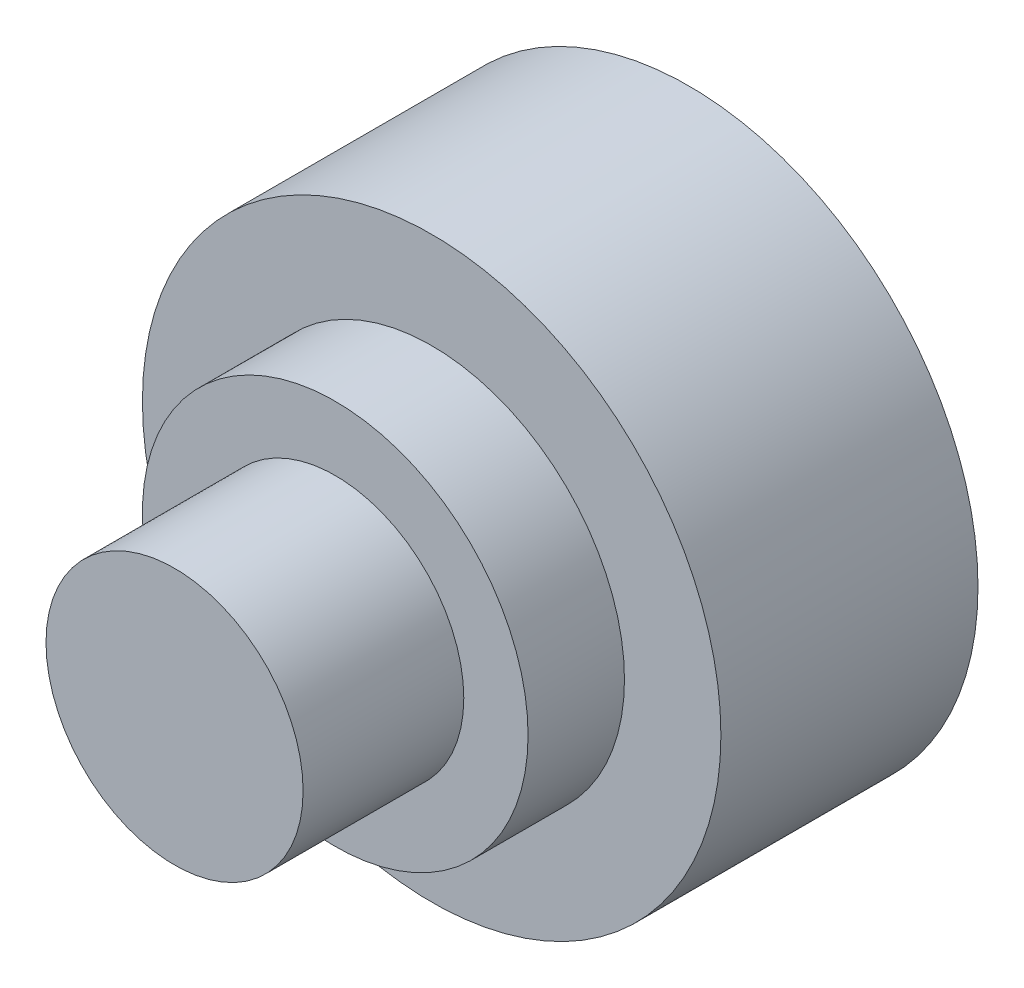
ISO-10303-21;
HEADER;
FILE_DESCRIPTION(('STEP AP214'),'2;1');
FILE_NAME('part.step','',(''),(''),'','','');
FILE_SCHEMA(('AUTOMOTIVE_DESIGN { 1 0 10303 214 1 1 1 1 }'));
ENDSEC;
DATA;
#1=APPLICATION_CONTEXT('core data for automotive mechanical design processes');
#2=APPLICATION_PROTOCOL_DEFINITION('international standard','automotive_design',2000,#1);
#3=PRODUCT_CONTEXT('',#1,'mechanical');
#4=PRODUCT('Part','Part','',(#3));
#5=PRODUCT_RELATED_PRODUCT_CATEGORY('part','',(#4));
#6=PRODUCT_DEFINITION_FORMATION('','',#4);
#7=PRODUCT_DEFINITION_CONTEXT('part definition',#1,'design');
#8=PRODUCT_DEFINITION('design','',#6,#7);
#9=PRODUCT_DEFINITION_SHAPE('','',#8);
#10=(LENGTH_UNIT() NAMED_UNIT(*) SI_UNIT(.MILLI.,.METRE.));
#11=(NAMED_UNIT(*) PLANE_ANGLE_UNIT() SI_UNIT($,.RADIAN.));
#12=(NAMED_UNIT(*) SI_UNIT($,.STERADIAN.) SOLID_ANGLE_UNIT());
#13=UNCERTAINTY_MEASURE_WITH_UNIT(LENGTH_MEASURE(1.E-05),#10,'distance_accuracy_value','');
#14=(GEOMETRIC_REPRESENTATION_CONTEXT(3) GLOBAL_UNCERTAINTY_ASSIGNED_CONTEXT((#13)) GLOBAL_UNIT_ASSIGNED_CONTEXT((#10,
#11,#12)) REPRESENTATION_CONTEXT('',''));
#15=CARTESIAN_POINT('',(0.,0.,0.));
#16=DIRECTION('',(0.,0.,1.));
#17=DIRECTION('',(1.,0.,0.));
#18=AXIS2_PLACEMENT_3D('',#15,#16,#17);
#19=CARTESIAN_POINT('',(0.,0.,8.));
#20=DIRECTION('',(0.,0.,-1.));
#21=DIRECTION('',(-1.,0.,0.));
#22=AXIS2_PLACEMENT_3D('',#19,#20,#21);
#23=CYLINDRICAL_SURFACE('',#22,9.);
#24=CARTESIAN_POINT('',(0.,0.,8.));
#25=DIRECTION('',(0.,0.,1.));
#26=DIRECTION('',(1.,0.,0.));
#27=AXIS2_PLACEMENT_3D('',#24,#25,#26);
#28=CIRCLE('',#27,9.);
#29=CARTESIAN_POINT('',(9.,0.,8.));
#30=VERTEX_POINT('',#29);
#31=EDGE_CURVE('E51',#30,#30,#28,.T.);
#32=ORIENTED_EDGE('',*,*,#31,.F.);
#33=EDGE_LOOP('',(#32));
#34=FACE_BOUND('',#33,.T.);
#35=CARTESIAN_POINT('',(0.,0.,0.));
#36=DIRECTION('',(0.,0.,1.));
#37=DIRECTION('',(1.,0.,0.));
#38=AXIS2_PLACEMENT_3D('',#35,#36,#37);
#39=CIRCLE('',#38,9.);
#40=CARTESIAN_POINT('',(9.,0.,0.));
#41=VERTEX_POINT('',#40);
#42=EDGE_CURVE('E42',#41,#41,#39,.T.);
#43=ORIENTED_EDGE('',*,*,#42,.T.);
#44=EDGE_LOOP('',(#43));
#45=FACE_BOUND('',#44,.T.);
#46=ADVANCED_FACE('F39',(#34,#45),#23,.T.);
#47=CARTESIAN_POINT('',(0.,0.,8.));
#48=DIRECTION('',(0.,0.,1.));
#49=DIRECTION('',(1.,0.,0.));
#50=AXIS2_PLACEMENT_3D('',#47,#48,#49);
#51=PLANE('',#50);
#52=CARTESIAN_POINT('',(0.,0.,8.));
#53=DIRECTION('',(0.,0.,1.));
#54=DIRECTION('',(1.,0.,0.));
#55=AXIS2_PLACEMENT_3D('',#52,#53,#54);
#56=CIRCLE('',#55,6.);
#57=CARTESIAN_POINT('',(6.,0.,8.));
#58=VERTEX_POINT('',#57);
#59=EDGE_CURVE('E46',#58,#58,#56,.T.);
#60=ORIENTED_EDGE('',*,*,#59,.F.);
#61=EDGE_LOOP('',(#60));
#62=FACE_BOUND('',#61,.T.);
#63=ORIENTED_EDGE('',*,*,#31,.T.);
#64=EDGE_LOOP('',(#63));
#65=FACE_BOUND('',#64,.T.);
#66=ADVANCED_FACE('F68',(#62,#65),#51,.T.);
#67=CARTESIAN_POINT('',(0.,0.,0.));
#68=DIRECTION('',(0.,0.,1.));
#69=DIRECTION('',(1.,0.,0.));
#70=AXIS2_PLACEMENT_3D('',#67,#68,#69);
#71=PLANE('',#70);
#72=ORIENTED_EDGE('',*,*,#42,.F.);
#73=EDGE_LOOP('',(#72));
#74=FACE_BOUND('',#73,.T.);
#75=ADVANCED_FACE('F65',(#74),#71,.F.);
#76=CARTESIAN_POINT('',(0.,0.,11.));
#77=DIRECTION('',(0.,0.,-1.));
#78=DIRECTION('',(-1.,0.,0.));
#79=AXIS2_PLACEMENT_3D('',#76,#77,#78);
#80=CYLINDRICAL_SURFACE('',#79,6.);
#81=CARTESIAN_POINT('',(0.,0.,11.));
#82=DIRECTION('',(0.,0.,1.));
#83=DIRECTION('',(1.,0.,0.));
#84=AXIS2_PLACEMENT_3D('',#81,#82,#83);
#85=CIRCLE('',#84,6.);
#86=CARTESIAN_POINT('',(6.,0.,11.));
#87=VERTEX_POINT('',#86);
#88=EDGE_CURVE('E56',#87,#87,#85,.T.);
#89=ORIENTED_EDGE('',*,*,#88,.F.);
#90=EDGE_LOOP('',(#89));
#91=FACE_BOUND('',#90,.T.);
#92=ORIENTED_EDGE('',*,*,#59,.T.);
#93=EDGE_LOOP('',(#92));
#94=FACE_BOUND('',#93,.T.);
#95=ADVANCED_FACE('F67',(#91,#94),#80,.T.);
#96=CARTESIAN_POINT('',(0.,0.,11.));
#97=DIRECTION('',(0.,0.,1.));
#98=DIRECTION('',(1.,0.,0.));
#99=AXIS2_PLACEMENT_3D('',#96,#97,#98);
#100=PLANE('',#99);
#101=CARTESIAN_POINT('',(0.,0.,11.));
#102=DIRECTION('',(0.,0.,1.));
#103=DIRECTION('',(1.,0.,0.));
#104=AXIS2_PLACEMENT_3D('',#101,#102,#103);
#105=CIRCLE('',#104,4.);
#106=CARTESIAN_POINT('',(4.,0.,11.));
#107=VERTEX_POINT('',#106);
#108=EDGE_CURVE('E10',#107,#107,#105,.T.);
#109=ORIENTED_EDGE('',*,*,#108,.F.);
#110=EDGE_LOOP('',(#109));
#111=FACE_BOUND('',#110,.T.);
#112=ORIENTED_EDGE('',*,*,#88,.T.);
#113=EDGE_LOOP('',(#112));
#114=FACE_BOUND('',#113,.T.);
#115=ADVANCED_FACE('F73',(#111,#114),#100,.T.);
#116=CARTESIAN_POINT('',(0.,0.,16.));
#117=DIRECTION('',(0.,0.,-1.));
#118=DIRECTION('',(-1.,0.,0.));
#119=AXIS2_PLACEMENT_3D('',#116,#117,#118);
#120=CYLINDRICAL_SURFACE('',#119,4.);
#121=CARTESIAN_POINT('',(0.,0.,16.));
#122=DIRECTION('',(0.,0.,1.));
#123=DIRECTION('',(1.,0.,0.));
#124=AXIS2_PLACEMENT_3D('',#121,#122,#123);
#125=CIRCLE('',#124,4.);
#126=CARTESIAN_POINT('',(4.,0.,16.));
#127=VERTEX_POINT('',#126);
#128=EDGE_CURVE('E55',#127,#127,#125,.T.);
#129=ORIENTED_EDGE('',*,*,#128,.F.);
#130=EDGE_LOOP('',(#129));
#131=FACE_BOUND('',#130,.T.);
#132=ORIENTED_EDGE('',*,*,#108,.T.);
#133=EDGE_LOOP('',(#132));
#134=FACE_BOUND('',#133,.T.);
#135=ADVANCED_FACE('F105',(#131,#134),#120,.T.);
#136=CARTESIAN_POINT('',(0.,0.,16.));
#137=DIRECTION('',(0.,0.,1.));
#138=DIRECTION('',(1.,0.,0.));
#139=AXIS2_PLACEMENT_3D('',#136,#137,#138);
#140=PLANE('',#139);
#141=ORIENTED_EDGE('',*,*,#128,.T.);
#142=EDGE_LOOP('',(#141));
#143=FACE_BOUND('',#142,.T.);
#144=ADVANCED_FACE('F116',(#143),#140,.T.);
#145=CLOSED_SHELL('',(#46,#66,#75,#95,#115,#135,#144));
#146=MANIFOLD_SOLID_BREP('B2',#145);
#147=ADVANCED_BREP_SHAPE_REPRESENTATION('',(#18,#146),#14);
#148=SHAPE_DEFINITION_REPRESENTATION(#9,#147);
ENDSEC;
END-ISO-10303-21;
